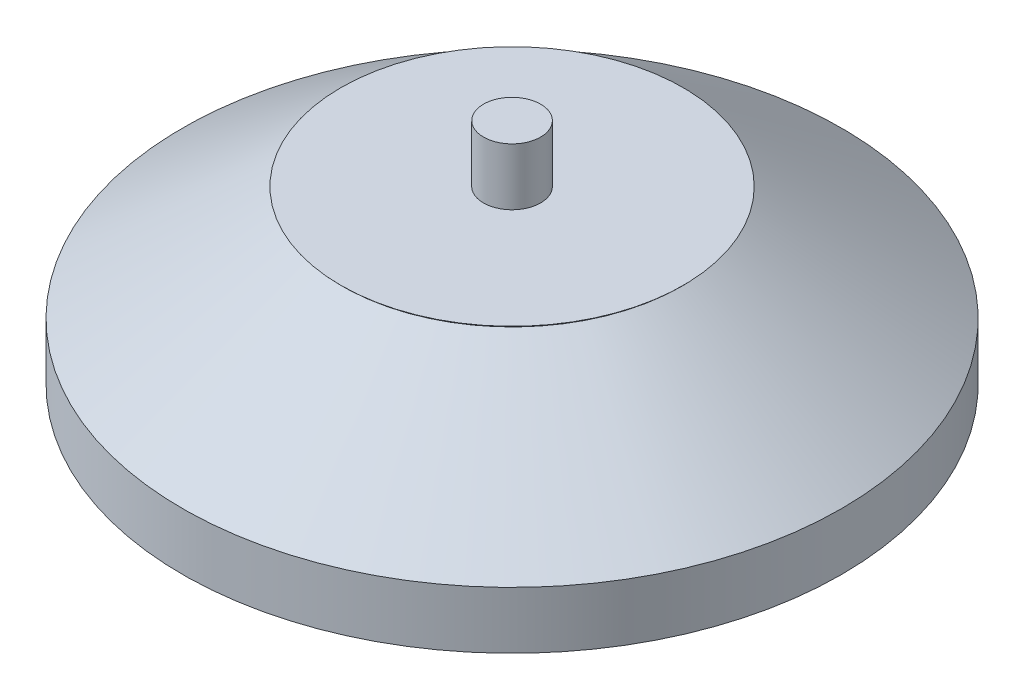
ISO-10303-21;
HEADER;
FILE_DESCRIPTION(('STEP AP214'),'2;1');
FILE_NAME('part.step','',(''),(''),'','','');
FILE_SCHEMA(('AUTOMOTIVE_DESIGN { 1 0 10303 214 1 1 1 1 }'));
ENDSEC;
DATA;
#1=APPLICATION_CONTEXT('core data for automotive mechanical design processes');
#2=APPLICATION_PROTOCOL_DEFINITION('international standard','automotive_design',2000,#1);
#3=PRODUCT_CONTEXT('',#1,'mechanical');
#4=PRODUCT('Part','Part','',(#3));
#5=PRODUCT_RELATED_PRODUCT_CATEGORY('part','',(#4));
#6=PRODUCT_DEFINITION_FORMATION('','',#4);
#7=PRODUCT_DEFINITION_CONTEXT('part definition',#1,'design');
#8=PRODUCT_DEFINITION('design','',#6,#7);
#9=PRODUCT_DEFINITION_SHAPE('','',#8);
#10=(LENGTH_UNIT() NAMED_UNIT(*) SI_UNIT(.MILLI.,.METRE.));
#11=(NAMED_UNIT(*) PLANE_ANGLE_UNIT() SI_UNIT($,.RADIAN.));
#12=(NAMED_UNIT(*) SI_UNIT($,.STERADIAN.) SOLID_ANGLE_UNIT());
#13=UNCERTAINTY_MEASURE_WITH_UNIT(LENGTH_MEASURE(1.E-05),#10,'distance_accuracy_value','');
#14=(GEOMETRIC_REPRESENTATION_CONTEXT(3) GLOBAL_UNCERTAINTY_ASSIGNED_CONTEXT((#13)) GLOBAL_UNIT_ASSIGNED_CONTEXT((#10,
#11,#12)) REPRESENTATION_CONTEXT('',''));
#15=CARTESIAN_POINT('',(0.,0.,0.));
#16=DIRECTION('',(0.,0.,1.));
#17=DIRECTION('',(1.,0.,0.));
#18=AXIS2_PLACEMENT_3D('',#15,#16,#17);
#19=CARTESIAN_POINT('',(0.,0.,0.));
#20=DIRECTION('',(0.,1.,0.));
#21=DIRECTION('',(0.,0.,1.));
#22=AXIS2_PLACEMENT_3D('',#19,#20,#21);
#23=PLANE('',#22);
#24=CARTESIAN_POINT('',(6.3211981986109,0.,0.));
#25=DIRECTION('',(0.,1.,0.));
#26=DIRECTION('',(0.,0.,1.));
#27=AXIS2_PLACEMENT_3D('',#24,#25,#26);
#28=CIRCLE('',#27,1.);
#29=CARTESIAN_POINT('',(6.3211981986109,0.,1.));
#30=VERTEX_POINT('',#29);
#31=EDGE_CURVE('E11',#30,#30,#28,.T.);
#32=ORIENTED_EDGE('',*,*,#31,.F.);
#33=EDGE_LOOP('',(#32));
#34=FACE_BOUND('',#33,.T.);
#35=CARTESIAN_POINT('',(6.3211981986109,0.,0.));
#36=DIRECTION('',(0.,1.,0.));
#37=DIRECTION('',(0.,0.,1.));
#38=AXIS2_PLACEMENT_3D('',#35,#36,#37);
#39=CIRCLE('',#38,5.99999999999994);
#40=CARTESIAN_POINT('',(6.3211981986109,0.,5.99999999999994));
#41=VERTEX_POINT('',#40);
#42=EDGE_CURVE('E48',#41,#41,#39,.F.);
#43=ORIENTED_EDGE('',*,*,#42,.F.);
#44=EDGE_LOOP('',(#43));
#45=FACE_BOUND('',#44,.T.);
#46=ADVANCED_FACE('F44',(#34,#45),#23,.T.);
#47=CARTESIAN_POINT('',(6.3211981986109,-0.0677951328201254,0.));
#48=DIRECTION('',(0.,-1.,0.));
#49=DIRECTION('',(1.,0.,0.));
#50=AXIS2_PLACEMENT_3D('',#47,#48,#49);
#51=CONICAL_SURFACE('',#50,5.93220486717981,0.959931088596887);
#52=CARTESIAN_POINT('',(6.3211981986109,-4.,0.));
#53=DIRECTION('',(0.,-1.,0.));
#54=DIRECTION('',(1.,0.,0.));
#55=AXIS2_PLACEMENT_3D('',#52,#53,#54);
#56=CIRCLE('',#55,11.5479754103445);
#57=CARTESIAN_POINT('',(17.8691736089554,-4.,0.));
#58=VERTEX_POINT('',#57);
#59=EDGE_CURVE('E66',#58,#58,#56,.T.);
#60=ORIENTED_EDGE('',*,*,#59,.F.);
#61=EDGE_LOOP('',(#60));
#62=FACE_BOUND('',#61,.T.);
#63=CARTESIAN_POINT('',(6.3211981986109,-0.0677951328201254,0.));
#64=DIRECTION('',(0.,1.,0.));
#65=DIRECTION('',(-1.,0.,0.));
#66=AXIS2_PLACEMENT_3D('',#63,#64,#65);
#67=CIRCLE('',#66,5.93220486717981);
#68=CARTESIAN_POINT('',(0.388993331431087,-0.0677951328201261,0.));
#69=VERTEX_POINT('',#68);
#70=EDGE_CURVE('E53',#69,#69,#67,.T.);
#71=ORIENTED_EDGE('',*,*,#70,.F.);
#72=EDGE_LOOP('',(#71));
#73=FACE_BOUND('',#72,.T.);
#74=ADVANCED_FACE('F90',(#62,#73),#51,.T.);
#75=CARTESIAN_POINT('',(6.3211981986109,6.,0.));
#76=DIRECTION('',(0.,1.,0.));
#77=DIRECTION('',(-1.,0.,0.));
#78=AXIS2_PLACEMENT_3D('',#75,#76,#77);
#79=CONICAL_SURFACE('',#78,12.,0.785398163397453);
#80=ORIENTED_EDGE('',*,*,#70,.T.);
#81=EDGE_LOOP('',(#80));
#82=FACE_BOUND('',#81,.T.);
#83=ORIENTED_EDGE('',*,*,#42,.T.);
#84=EDGE_LOOP('',(#83));
#85=FACE_BOUND('',#84,.T.);
#86=ADVANCED_FACE('F46',(#82,#85),#79,.T.);
#87=CARTESIAN_POINT('',(6.3211981986109,-6.,0.));
#88=DIRECTION('',(0.,1.,0.));
#89=DIRECTION('',(-1.,0.,0.));
#90=AXIS2_PLACEMENT_3D('',#87,#88,#89);
#91=CYLINDRICAL_SURFACE('',#90,11.5479754103445);
#92=CARTESIAN_POINT('',(6.3211981986109,-6.,0.));
#93=DIRECTION('',(0.,-1.,0.));
#94=DIRECTION('',(1.,0.,0.));
#95=AXIS2_PLACEMENT_3D('',#92,#93,#94);
#96=CIRCLE('',#95,11.5479754103445);
#97=CARTESIAN_POINT('',(17.8691736089554,-6.,0.));
#98=VERTEX_POINT('',#97);
#99=EDGE_CURVE('E62',#98,#98,#96,.T.);
#100=ORIENTED_EDGE('',*,*,#99,.F.);
#101=EDGE_LOOP('',(#100));
#102=FACE_BOUND('',#101,.T.);
#103=ORIENTED_EDGE('',*,*,#59,.T.);
#104=EDGE_LOOP('',(#103));
#105=FACE_BOUND('',#104,.T.);
#106=ADVANCED_FACE('F87',(#102,#105),#91,.T.);
#107=CARTESIAN_POINT('',(6.3211981986109,-6.,0.));
#108=DIRECTION('',(0.,-1.,0.));
#109=DIRECTION('',(1.,0.,0.));
#110=AXIS2_PLACEMENT_3D('',#107,#108,#109);
#111=PLANE('',#110);
#112=ORIENTED_EDGE('',*,*,#99,.T.);
#113=EDGE_LOOP('',(#112));
#114=FACE_BOUND('',#113,.T.);
#115=ADVANCED_FACE('F79',(#114),#111,.T.);
#116=CARTESIAN_POINT('',(6.3211981986109,2.,0.));
#117=DIRECTION('',(0.,-1.,0.));
#118=DIRECTION('',(0.,0.,-1.));
#119=AXIS2_PLACEMENT_3D('',#116,#117,#118);
#120=CYLINDRICAL_SURFACE('',#119,1.);
#121=CARTESIAN_POINT('',(6.3211981986109,2.,0.));
#122=DIRECTION('',(0.,1.,0.));
#123=DIRECTION('',(0.,0.,1.));
#124=AXIS2_PLACEMENT_3D('',#121,#122,#123);
#125=CIRCLE('',#124,1.);
#126=CARTESIAN_POINT('',(6.3211981986109,2.,1.));
#127=VERTEX_POINT('',#126);
#128=EDGE_CURVE('E61',#127,#127,#125,.T.);
#129=ORIENTED_EDGE('',*,*,#128,.F.);
#130=EDGE_LOOP('',(#129));
#131=FACE_BOUND('',#130,.T.);
#132=ORIENTED_EDGE('',*,*,#31,.T.);
#133=EDGE_LOOP('',(#132));
#134=FACE_BOUND('',#133,.T.);
#135=ADVANCED_FACE('F77',(#131,#134),#120,.T.);
#136=CARTESIAN_POINT('',(6.3211981986109,2.,0.));
#137=DIRECTION('',(0.,1.,0.));
#138=DIRECTION('',(0.,0.,1.));
#139=AXIS2_PLACEMENT_3D('',#136,#137,#138);
#140=PLANE('',#139);
#141=ORIENTED_EDGE('',*,*,#128,.T.);
#142=EDGE_LOOP('',(#141));
#143=FACE_BOUND('',#142,.T.);
#144=ADVANCED_FACE('F75',(#143),#140,.T.);
#145=CLOSED_SHELL('',(#46,#74,#86,#106,#115,#135,#144));
#146=MANIFOLD_SOLID_BREP('B2',#145);
#147=ADVANCED_BREP_SHAPE_REPRESENTATION('',(#18,#146),#14);
#148=SHAPE_DEFINITION_REPRESENTATION(#9,#147);
ENDSEC;
END-ISO-10303-21;
